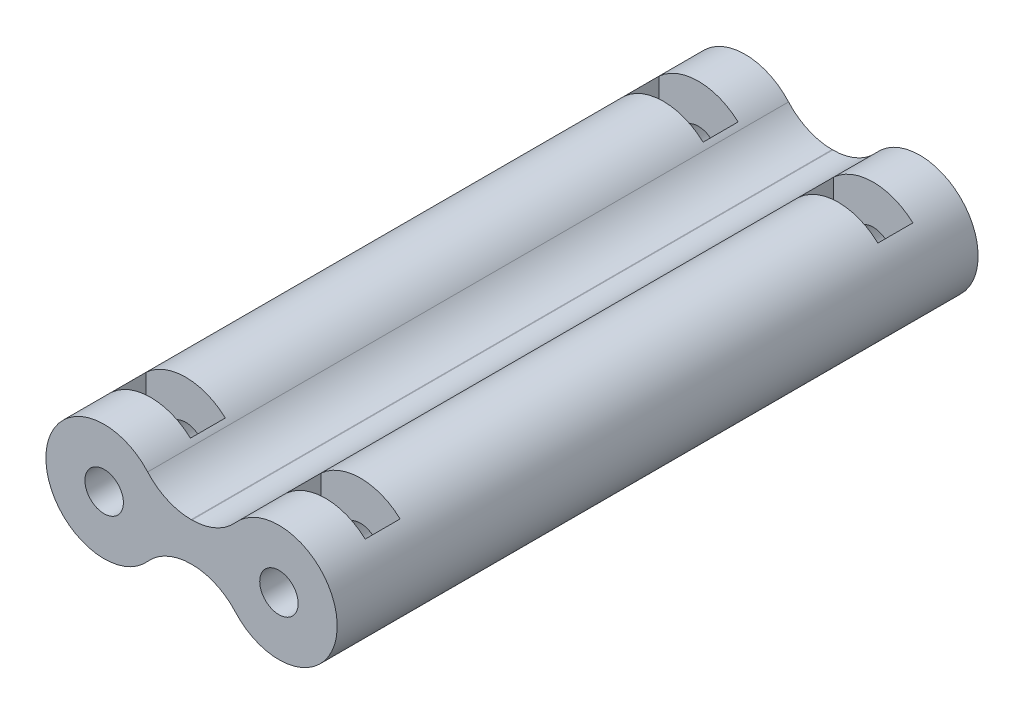
ISO-10303-21;
HEADER;
FILE_DESCRIPTION(('STEP AP214'),'2;1');
FILE_NAME('part.step','',(''),(''),'','','');
FILE_SCHEMA(('AUTOMOTIVE_DESIGN { 1 0 10303 214 1 1 1 1 }'));
ENDSEC;
DATA;
#1=APPLICATION_CONTEXT('core data for automotive mechanical design processes');
#2=APPLICATION_PROTOCOL_DEFINITION('international standard','automotive_design',2000,#1);
#3=PRODUCT_CONTEXT('',#1,'mechanical');
#4=PRODUCT('Part','Part','',(#3));
#5=PRODUCT_RELATED_PRODUCT_CATEGORY('part','',(#4));
#6=PRODUCT_DEFINITION_FORMATION('','',#4);
#7=PRODUCT_DEFINITION_CONTEXT('part definition',#1,'design');
#8=PRODUCT_DEFINITION('design','',#6,#7);
#9=PRODUCT_DEFINITION_SHAPE('','',#8);
#10=(LENGTH_UNIT() NAMED_UNIT(*) SI_UNIT(.MILLI.,.METRE.));
#11=(NAMED_UNIT(*) PLANE_ANGLE_UNIT() SI_UNIT($,.RADIAN.));
#12=(NAMED_UNIT(*) SI_UNIT($,.STERADIAN.) SOLID_ANGLE_UNIT());
#13=UNCERTAINTY_MEASURE_WITH_UNIT(LENGTH_MEASURE(1.E-05),#10,'distance_accuracy_value','');
#14=(GEOMETRIC_REPRESENTATION_CONTEXT(3) GLOBAL_UNCERTAINTY_ASSIGNED_CONTEXT((#13)) GLOBAL_UNIT_ASSIGNED_CONTEXT((#10,
#11,#12)) REPRESENTATION_CONTEXT('',''));
#15=CARTESIAN_POINT('',(0.,0.,0.));
#16=DIRECTION('',(0.,0.,1.));
#17=DIRECTION('',(1.,0.,0.));
#18=AXIS2_PLACEMENT_3D('',#15,#16,#17);
#19=CARTESIAN_POINT('',(-7.5,0.,55.));
#20=DIRECTION('',(0.,0.,-1.));
#21=DIRECTION('',(-1.,0.,0.));
#22=AXIS2_PLACEMENT_3D('',#19,#20,#21);
#23=CYLINDRICAL_SURFACE('',#22,5.);
#24=DIRECTION('',(0.,0.,-1.));
#25=VECTOR('',#24,1.);
#26=CARTESIAN_POINT('',(-10.9,-3.66606055596469,55.));
#27=LINE('',#26,#25);
#28=CARTESIAN_POINT('',(-10.9,-3.66606055596468,51.));
#29=VERTEX_POINT('',#28);
#30=CARTESIAN_POINT('',(-10.9,-3.66606055596468,48.));
#31=VERTEX_POINT('',#30);
#32=EDGE_CURVE('E40',#29,#31,#27,.T.);
#33=ORIENTED_EDGE('',*,*,#32,.F.);
#34=CARTESIAN_POINT('',(-7.5,0.,51.));
#35=DIRECTION('',(0.,0.,1.));
#36=DIRECTION('',(1.,0.,0.));
#37=AXIS2_PLACEMENT_3D('',#34,#35,#36);
#38=CIRCLE('',#37,5.);
#39=CARTESIAN_POINT('',(-4.09999999999999,-3.66606055596466,51.));
#40=VERTEX_POINT('',#39);
#41=EDGE_CURVE('E47',#29,#40,#38,.T.);
#42=ORIENTED_EDGE('',*,*,#41,.T.);
#43=DIRECTION('',(0.,0.,-1.));
#44=VECTOR('',#43,1.);
#45=CARTESIAN_POINT('',(-4.09999999999999,-3.66606055596466,55.));
#46=LINE('',#45,#44);
#47=CARTESIAN_POINT('',(-4.09999999999999,-3.66606055596466,48.));
#48=VERTEX_POINT('',#47);
#49=EDGE_CURVE('E383',#40,#48,#46,.T.);
#50=ORIENTED_EDGE('',*,*,#49,.T.);
#51=CARTESIAN_POINT('',(-7.5,0.,48.));
#52=DIRECTION('',(0.,0.,1.));
#53=DIRECTION('',(1.,0.,0.));
#54=AXIS2_PLACEMENT_3D('',#51,#52,#53);
#55=CIRCLE('',#54,5.);
#56=EDGE_CURVE('E248',#31,#48,#55,.T.);
#57=ORIENTED_EDGE('',*,*,#56,.F.);
#58=EDGE_LOOP('',(#33,#42,#50,#57));
#59=FACE_BOUND('',#58,.T.);
#60=DIRECTION('',(0.,0.,-1.));
#61=VECTOR('',#60,1.);
#62=CARTESIAN_POINT('',(-10.9,-3.66606055596467,55.));
#63=LINE('',#62,#61);
#64=CARTESIAN_POINT('',(-10.9,-3.66606055596467,4.));
#65=VERTEX_POINT('',#64);
#66=CARTESIAN_POINT('',(-10.9,-3.66606055596467,7.));
#67=VERTEX_POINT('',#66);
#68=EDGE_CURVE('E352',#65,#67,#63,.F.);
#69=ORIENTED_EDGE('',*,*,#68,.T.);
#70=CARTESIAN_POINT('',(-7.5,0.,7.));
#71=DIRECTION('',(0.,0.,1.));
#72=DIRECTION('',(1.,0.,0.));
#73=AXIS2_PLACEMENT_3D('',#70,#71,#72);
#74=CIRCLE('',#73,5.);
#75=CARTESIAN_POINT('',(-4.1,-3.66606055596467,7.));
#76=VERTEX_POINT('',#75);
#77=EDGE_CURVE('E268',#67,#76,#74,.T.);
#78=ORIENTED_EDGE('',*,*,#77,.T.);
#79=DIRECTION('',(0.,0.,-1.));
#80=VECTOR('',#79,1.);
#81=CARTESIAN_POINT('',(-4.09999999999998,-3.66606055596466,55.));
#82=LINE('',#81,#80);
#83=CARTESIAN_POINT('',(-4.1,-3.66606055596467,4.));
#84=VERTEX_POINT('',#83);
#85=EDGE_CURVE('E349',#84,#76,#82,.F.);
#86=ORIENTED_EDGE('',*,*,#85,.F.);
#87=CARTESIAN_POINT('',(-7.5,0.,4.));
#88=DIRECTION('',(0.,0.,1.));
#89=DIRECTION('',(1.,0.,0.));
#90=AXIS2_PLACEMENT_3D('',#87,#88,#89);
#91=CIRCLE('',#90,5.);
#92=EDGE_CURVE('E264',#65,#84,#91,.T.);
#93=ORIENTED_EDGE('',*,*,#92,.F.);
#94=EDGE_LOOP('',(#69,#78,#86,#93));
#95=FACE_BOUND('',#94,.T.);
#96=CARTESIAN_POINT('',(-7.5,0.,0.));
#97=DIRECTION('',(0.,0.,1.));
#98=DIRECTION('',(1.,0.,0.));
#99=AXIS2_PLACEMENT_3D('',#96,#97,#98);
#100=CIRCLE('',#99,5.);
#101=CARTESIAN_POINT('',(-3.76578321464862,3.325,0.));
#102=VERTEX_POINT('',#101);
#103=CARTESIAN_POINT('',(-3.76578321464862,-3.325,0.));
#104=VERTEX_POINT('',#103);
#105=EDGE_CURVE('E278',#102,#104,#100,.T.);
#106=ORIENTED_EDGE('',*,*,#105,.T.);
#107=DIRECTION('',(0.,0.,-1.));
#108=VECTOR('',#107,1.);
#109=CARTESIAN_POINT('',(-3.76578321464862,-3.325,55.));
#110=LINE('',#109,#108);
#111=CARTESIAN_POINT('',(-3.76578321464862,-3.325,55.));
#112=VERTEX_POINT('',#111);
#113=EDGE_CURVE('E312',#104,#112,#110,.F.);
#114=ORIENTED_EDGE('',*,*,#113,.T.);
#115=CARTESIAN_POINT('',(-7.5,0.,55.));
#116=DIRECTION('',(0.,0.,1.));
#117=DIRECTION('',(1.,0.,0.));
#118=AXIS2_PLACEMENT_3D('',#115,#116,#117);
#119=CIRCLE('',#118,5.);
#120=CARTESIAN_POINT('',(-3.76578321464862,3.325,55.));
#121=VERTEX_POINT('',#120);
#122=EDGE_CURVE('E281',#121,#112,#119,.T.);
#123=ORIENTED_EDGE('',*,*,#122,.F.);
#124=DIRECTION('',(0.,0.,-1.));
#125=VECTOR('',#124,1.);
#126=CARTESIAN_POINT('',(-3.76578321464862,3.325,55.));
#127=LINE('',#126,#125);
#128=EDGE_CURVE('E309',#121,#102,#127,.T.);
#129=ORIENTED_EDGE('',*,*,#128,.T.);
#130=EDGE_LOOP('',(#106,#114,#123,#129));
#131=FACE_BOUND('',#130,.T.);
#132=CARTESIAN_POINT('',(-4.1,3.66606055596467,4.));
#133=VERTEX_POINT('',#132);
#134=CARTESIAN_POINT('',(-10.9,3.66606055596467,4.));
#135=VERTEX_POINT('',#134);
#136=EDGE_CURVE('E261',#133,#135,#91,.T.);
#137=ORIENTED_EDGE('',*,*,#136,.F.);
#138=DIRECTION('',(0.,0.,-1.));
#139=VECTOR('',#138,1.);
#140=CARTESIAN_POINT('',(-4.09999999999998,3.66606055596466,55.));
#141=LINE('',#140,#139);
#142=CARTESIAN_POINT('',(-4.1,3.66606055596467,7.));
#143=VERTEX_POINT('',#142);
#144=EDGE_CURVE('E347',#143,#133,#141,.T.);
#145=ORIENTED_EDGE('',*,*,#144,.F.);
#146=CARTESIAN_POINT('',(-10.9,3.66606055596467,7.));
#147=VERTEX_POINT('',#146);
#148=EDGE_CURVE('E265',#143,#147,#74,.T.);
#149=ORIENTED_EDGE('',*,*,#148,.T.);
#150=DIRECTION('',(0.,0.,-1.));
#151=VECTOR('',#150,1.);
#152=CARTESIAN_POINT('',(-10.9,3.66606055596467,55.));
#153=LINE('',#152,#151);
#154=EDGE_CURVE('E340',#147,#135,#153,.T.);
#155=ORIENTED_EDGE('',*,*,#154,.T.);
#156=EDGE_LOOP('',(#137,#145,#149,#155));
#157=FACE_BOUND('',#156,.T.);
#158=CARTESIAN_POINT('',(-4.09999999999999,3.66606055596466,48.));
#159=VERTEX_POINT('',#158);
#160=CARTESIAN_POINT('',(-10.9,3.66606055596468,48.));
#161=VERTEX_POINT('',#160);
#162=EDGE_CURVE('E245',#159,#161,#55,.T.);
#163=ORIENTED_EDGE('',*,*,#162,.F.);
#164=DIRECTION('',(0.,0.,-1.));
#165=VECTOR('',#164,1.);
#166=CARTESIAN_POINT('',(-4.09999999999999,3.66606055596466,55.));
#167=LINE('',#166,#165);
#168=CARTESIAN_POINT('',(-4.09999999999999,3.66606055596466,51.));
#169=VERTEX_POINT('',#168);
#170=EDGE_CURVE('E11',#159,#169,#167,.F.);
#171=ORIENTED_EDGE('',*,*,#170,.T.);
#172=CARTESIAN_POINT('',(-10.9,3.66606055596468,51.));
#173=VERTEX_POINT('',#172);
#174=EDGE_CURVE('E54',#169,#173,#38,.T.);
#175=ORIENTED_EDGE('',*,*,#174,.T.);
#176=DIRECTION('',(0.,0.,-1.));
#177=VECTOR('',#176,1.);
#178=CARTESIAN_POINT('',(-10.9,3.66606055596469,55.));
#179=LINE('',#178,#177);
#180=EDGE_CURVE('E380',#161,#173,#179,.F.);
#181=ORIENTED_EDGE('',*,*,#180,.F.);
#182=EDGE_LOOP('',(#163,#171,#175,#181));
#183=FACE_BOUND('',#182,.T.);
#184=ADVANCED_FACE('F32',(#59,#95,#131,#157,#183),#23,.T.);
#185=CARTESIAN_POINT('',(7.5,0.,55.));
#186=DIRECTION('',(0.,0.,-1.));
#187=DIRECTION('',(-1.,0.,0.));
#188=AXIS2_PLACEMENT_3D('',#185,#186,#187);
#189=CYLINDRICAL_SURFACE('',#188,5.);
#190=DIRECTION('',(0.,0.,-1.));
#191=VECTOR('',#190,1.);
#192=CARTESIAN_POINT('',(10.9,-3.66606055596467,55.));
#193=LINE('',#192,#191);
#194=CARTESIAN_POINT('',(10.9,-3.66606055596467,4.));
#195=VERTEX_POINT('',#194);
#196=CARTESIAN_POINT('',(10.9,-3.66606055596467,7.));
#197=VERTEX_POINT('',#196);
#198=EDGE_CURVE('E375',#195,#197,#193,.F.);
#199=ORIENTED_EDGE('',*,*,#198,.F.);
#200=CARTESIAN_POINT('',(7.5,0.,4.));
#201=DIRECTION('',(0.,0.,-1.));
#202=DIRECTION('',(-1.,0.,0.));
#203=AXIS2_PLACEMENT_3D('',#200,#201,#202);
#204=CIRCLE('',#203,5.);
#205=CARTESIAN_POINT('',(4.1,-3.66606055596467,4.));
#206=VERTEX_POINT('',#205);
#207=EDGE_CURVE('E238',#195,#206,#204,.T.);
#208=ORIENTED_EDGE('',*,*,#207,.T.);
#209=DIRECTION('',(0.,0.,-1.));
#210=VECTOR('',#209,1.);
#211=CARTESIAN_POINT('',(4.09999999999999,-3.66606055596466,55.));
#212=LINE('',#211,#210);
#213=CARTESIAN_POINT('',(4.1,-3.66606055596466,7.));
#214=VERTEX_POINT('',#213);
#215=EDGE_CURVE('E372',#206,#214,#212,.F.);
#216=ORIENTED_EDGE('',*,*,#215,.T.);
#217=CARTESIAN_POINT('',(7.5,0.,7.));
#218=DIRECTION('',(0.,0.,-1.));
#219=DIRECTION('',(-1.,0.,0.));
#220=AXIS2_PLACEMENT_3D('',#217,#218,#219);
#221=CIRCLE('',#220,5.);
#222=EDGE_CURVE('E242',#197,#214,#221,.T.);
#223=ORIENTED_EDGE('',*,*,#222,.F.);
#224=EDGE_LOOP('',(#199,#208,#216,#223));
#225=FACE_BOUND('',#224,.T.);
#226=DIRECTION('',(0.,0.,-1.));
#227=VECTOR('',#226,1.);
#228=CARTESIAN_POINT('',(10.9,-3.66606055596467,55.));
#229=LINE('',#228,#227);
#230=CARTESIAN_POINT('',(10.9,-3.66606055596467,51.));
#231=VERTEX_POINT('',#230);
#232=CARTESIAN_POINT('',(10.9,-3.66606055596467,48.));
#233=VERTEX_POINT('',#232);
#234=EDGE_CURVE('E195',#231,#233,#229,.T.);
#235=ORIENTED_EDGE('',*,*,#234,.T.);
#236=CARTESIAN_POINT('',(7.5,0.,48.));
#237=DIRECTION('',(0.,0.,-1.));
#238=DIRECTION('',(-1.,0.,0.));
#239=AXIS2_PLACEMENT_3D('',#236,#237,#238);
#240=CIRCLE('',#239,5.);
#241=CARTESIAN_POINT('',(4.1,-3.66606055596467,48.));
#242=VERTEX_POINT('',#241);
#243=EDGE_CURVE('E234',#233,#242,#240,.T.);
#244=ORIENTED_EDGE('',*,*,#243,.T.);
#245=DIRECTION('',(0.,0.,-1.));
#246=VECTOR('',#245,1.);
#247=CARTESIAN_POINT('',(4.1,-3.66606055596468,55.));
#248=LINE('',#247,#246);
#249=CARTESIAN_POINT('',(4.1,-3.66606055596467,51.));
#250=VERTEX_POINT('',#249);
#251=EDGE_CURVE('E206',#250,#242,#248,.T.);
#252=ORIENTED_EDGE('',*,*,#251,.F.);
#253=CARTESIAN_POINT('',(7.5,0.,51.));
#254=DIRECTION('',(0.,0.,-1.));
#255=DIRECTION('',(-1.,0.,0.));
#256=AXIS2_PLACEMENT_3D('',#253,#254,#255);
#257=CIRCLE('',#256,5.);
#258=EDGE_CURVE('E211',#231,#250,#257,.T.);
#259=ORIENTED_EDGE('',*,*,#258,.F.);
#260=EDGE_LOOP('',(#235,#244,#252,#259));
#261=FACE_BOUND('',#260,.T.);
#262=CARTESIAN_POINT('',(7.5,0.,55.));
#263=DIRECTION('',(0.,0.,1.));
#264=DIRECTION('',(1.,0.,0.));
#265=AXIS2_PLACEMENT_3D('',#262,#263,#264);
#266=CIRCLE('',#265,5.);
#267=CARTESIAN_POINT('',(3.76578321464862,-3.325,55.));
#268=VERTEX_POINT('',#267);
#269=CARTESIAN_POINT('',(3.76578321464862,3.325,55.));
#270=VERTEX_POINT('',#269);
#271=EDGE_CURVE('E288',#268,#270,#266,.T.);
#272=ORIENTED_EDGE('',*,*,#271,.F.);
#273=DIRECTION('',(0.,0.,-1.));
#274=VECTOR('',#273,1.);
#275=CARTESIAN_POINT('',(3.76578321464862,-3.325,55.));
#276=LINE('',#275,#274);
#277=CARTESIAN_POINT('',(3.76578321464862,-3.325,0.));
#278=VERTEX_POINT('',#277);
#279=EDGE_CURVE('E316',#268,#278,#276,.T.);
#280=ORIENTED_EDGE('',*,*,#279,.T.);
#281=CARTESIAN_POINT('',(7.5,0.,0.));
#282=DIRECTION('',(0.,0.,1.));
#283=DIRECTION('',(1.,0.,0.));
#284=AXIS2_PLACEMENT_3D('',#281,#282,#283);
#285=CIRCLE('',#284,5.);
#286=CARTESIAN_POINT('',(3.76578321464862,3.325,0.));
#287=VERTEX_POINT('',#286);
#288=EDGE_CURVE('E300',#278,#287,#285,.T.);
#289=ORIENTED_EDGE('',*,*,#288,.T.);
#290=DIRECTION('',(0.,0.,-1.));
#291=VECTOR('',#290,1.);
#292=CARTESIAN_POINT('',(3.76578321464862,3.325,55.));
#293=LINE('',#292,#291);
#294=EDGE_CURVE('E314',#287,#270,#293,.F.);
#295=ORIENTED_EDGE('',*,*,#294,.T.);
#296=EDGE_LOOP('',(#272,#280,#289,#295));
#297=FACE_BOUND('',#296,.T.);
#298=CARTESIAN_POINT('',(4.1,3.66606055596467,51.));
#299=VERTEX_POINT('',#298);
#300=CARTESIAN_POINT('',(10.9,3.66606055596467,51.));
#301=VERTEX_POINT('',#300);
#302=EDGE_CURVE('E214',#299,#301,#257,.T.);
#303=ORIENTED_EDGE('',*,*,#302,.F.);
#304=DIRECTION('',(0.,0.,-1.));
#305=VECTOR('',#304,1.);
#306=CARTESIAN_POINT('',(4.1,3.66606055596468,55.));
#307=LINE('',#306,#305);
#308=CARTESIAN_POINT('',(4.1,3.66606055596467,48.));
#309=VERTEX_POINT('',#308);
#310=EDGE_CURVE('E367',#309,#299,#307,.F.);
#311=ORIENTED_EDGE('',*,*,#310,.F.);
#312=CARTESIAN_POINT('',(10.9,3.66606055596467,48.));
#313=VERTEX_POINT('',#312);
#314=EDGE_CURVE('E231',#309,#313,#240,.T.);
#315=ORIENTED_EDGE('',*,*,#314,.T.);
#316=DIRECTION('',(0.,0.,-1.));
#317=VECTOR('',#316,1.);
#318=CARTESIAN_POINT('',(10.9,3.66606055596467,55.));
#319=LINE('',#318,#317);
#320=EDGE_CURVE('E354',#313,#301,#319,.F.);
#321=ORIENTED_EDGE('',*,*,#320,.T.);
#322=EDGE_LOOP('',(#303,#311,#315,#321));
#323=FACE_BOUND('',#322,.T.);
#324=CARTESIAN_POINT('',(4.1,3.66606055596466,7.));
#325=VERTEX_POINT('',#324);
#326=CARTESIAN_POINT('',(10.9,3.66606055596467,7.));
#327=VERTEX_POINT('',#326);
#328=EDGE_CURVE('E239',#325,#327,#221,.T.);
#329=ORIENTED_EDGE('',*,*,#328,.F.);
#330=DIRECTION('',(0.,0.,-1.));
#331=VECTOR('',#330,1.);
#332=CARTESIAN_POINT('',(4.09999999999999,3.66606055596466,55.));
#333=LINE('',#332,#331);
#334=CARTESIAN_POINT('',(4.1,3.66606055596467,4.));
#335=VERTEX_POINT('',#334);
#336=EDGE_CURVE('E377',#325,#335,#333,.T.);
#337=ORIENTED_EDGE('',*,*,#336,.T.);
#338=CARTESIAN_POINT('',(10.9,3.66606055596467,4.));
#339=VERTEX_POINT('',#338);
#340=EDGE_CURVE('E235',#335,#339,#204,.T.);
#341=ORIENTED_EDGE('',*,*,#340,.T.);
#342=DIRECTION('',(0.,0.,-1.));
#343=VECTOR('',#342,1.);
#344=CARTESIAN_POINT('',(10.9,3.66606055596467,55.));
#345=LINE('',#344,#343);
#346=EDGE_CURVE('E205',#327,#339,#345,.T.);
#347=ORIENTED_EDGE('',*,*,#346,.F.);
#348=EDGE_LOOP('',(#329,#337,#341,#347));
#349=FACE_BOUND('',#348,.T.);
#350=ADVANCED_FACE('F218',(#225,#261,#297,#323,#349),#189,.T.);
#351=CARTESIAN_POINT('',(-7.5,0.,55.));
#352=DIRECTION('',(0.,0.,-1.));
#353=DIRECTION('',(-1.,0.,0.));
#354=AXIS2_PLACEMENT_3D('',#351,#352,#353);
#355=CYLINDRICAL_SURFACE('',#354,1.65);
#356=CARTESIAN_POINT('',(-7.5,0.,7.));
#357=DIRECTION('',(0.,0.,1.));
#358=DIRECTION('',(1.,0.,0.));
#359=AXIS2_PLACEMENT_3D('',#356,#357,#358);
#360=CIRCLE('',#359,1.65);
#361=CARTESIAN_POINT('',(-5.85,0.,7.));
#362=VERTEX_POINT('',#361);
#363=EDGE_CURVE('E263',#362,#362,#360,.T.);
#364=ORIENTED_EDGE('',*,*,#363,.F.);
#365=EDGE_LOOP('',(#364));
#366=FACE_BOUND('',#365,.T.);
#367=CARTESIAN_POINT('',(-7.5,0.,48.));
#368=DIRECTION('',(0.,0.,1.));
#369=DIRECTION('',(1.,0.,0.));
#370=AXIS2_PLACEMENT_3D('',#367,#368,#369);
#371=CIRCLE('',#370,1.65);
#372=CARTESIAN_POINT('',(-5.85,0.,48.));
#373=VERTEX_POINT('',#372);
#374=EDGE_CURVE('E244',#373,#373,#371,.T.);
#375=ORIENTED_EDGE('',*,*,#374,.T.);
#376=EDGE_LOOP('',(#375));
#377=FACE_BOUND('',#376,.T.);
#378=ADVANCED_FACE('F456',(#366,#377),#355,.F.);
#379=CARTESIAN_POINT('',(7.5,0.,55.));
#380=DIRECTION('',(0.,0.,-1.));
#381=DIRECTION('',(-1.,0.,0.));
#382=AXIS2_PLACEMENT_3D('',#379,#380,#381);
#383=CYLINDRICAL_SURFACE('',#382,1.65);
#384=CARTESIAN_POINT('',(7.5,0.,55.));
#385=DIRECTION('',(0.,0.,1.));
#386=DIRECTION('',(1.,0.,0.));
#387=AXIS2_PLACEMENT_3D('',#384,#385,#386);
#388=CIRCLE('',#387,1.65);
#389=CARTESIAN_POINT('',(9.15,0.,55.));
#390=VERTEX_POINT('',#389);
#391=EDGE_CURVE('E269',#390,#390,#388,.T.);
#392=ORIENTED_EDGE('',*,*,#391,.T.);
#393=EDGE_LOOP('',(#392));
#394=FACE_BOUND('',#393,.T.);
#395=CARTESIAN_POINT('',(7.5,0.,51.));
#396=DIRECTION('',(0.,0.,-1.));
#397=DIRECTION('',(-1.,0.,0.));
#398=AXIS2_PLACEMENT_3D('',#395,#396,#397);
#399=CIRCLE('',#398,1.65);
#400=CARTESIAN_POINT('',(5.85,0.,51.));
#401=VERTEX_POINT('',#400);
#402=EDGE_CURVE('E221',#401,#401,#399,.T.);
#403=ORIENTED_EDGE('',*,*,#402,.T.);
#404=EDGE_LOOP('',(#403));
#405=FACE_BOUND('',#404,.T.);
#406=ADVANCED_FACE('F519',(#394,#405),#383,.F.);
#407=CARTESIAN_POINT('',(-7.5,0.,0.));
#408=DIRECTION('',(0.,0.,1.));
#409=DIRECTION('',(1.,0.,0.));
#410=AXIS2_PLACEMENT_3D('',#407,#408,#409);
#411=CIRCLE('',#410,1.65);
#412=CARTESIAN_POINT('',(-5.85,0.,0.));
#413=VERTEX_POINT('',#412);
#414=EDGE_CURVE('E272',#413,#413,#411,.T.);
#415=ORIENTED_EDGE('',*,*,#414,.F.);
#416=EDGE_LOOP('',(#415));
#417=FACE_BOUND('',#416,.T.);
#418=CARTESIAN_POINT('',(-7.5,0.,4.));
#419=DIRECTION('',(0.,0.,1.));
#420=DIRECTION('',(1.,0.,0.));
#421=AXIS2_PLACEMENT_3D('',#418,#419,#420);
#422=CIRCLE('',#421,1.65);
#423=CARTESIAN_POINT('',(-5.85,0.,4.));
#424=VERTEX_POINT('',#423);
#425=EDGE_CURVE('E252',#424,#424,#422,.T.);
#426=ORIENTED_EDGE('',*,*,#425,.T.);
#427=EDGE_LOOP('',(#426));
#428=FACE_BOUND('',#427,.T.);
#429=ADVANCED_FACE('F525',(#417,#428),#355,.F.);
#430=CARTESIAN_POINT('',(-7.5,0.,55.));
#431=DIRECTION('',(0.,0.,1.));
#432=DIRECTION('',(1.,0.,0.));
#433=AXIS2_PLACEMENT_3D('',#430,#431,#432);
#434=PLANE('',#433);
#435=CARTESIAN_POINT('',(-7.5,0.,55.));
#436=DIRECTION('',(0.,0.,1.));
#437=DIRECTION('',(1.,0.,0.));
#438=AXIS2_PLACEMENT_3D('',#435,#436,#437);
#439=CIRCLE('',#438,1.65);
#440=CARTESIAN_POINT('',(-5.85,0.,55.));
#441=VERTEX_POINT('',#440);
#442=EDGE_CURVE('E275',#441,#441,#439,.T.);
#443=ORIENTED_EDGE('',*,*,#442,.F.);
#444=EDGE_LOOP('',(#443));
#445=FACE_BOUND('',#444,.T.);
#446=DIRECTION('',(-1.,0.,0.));
#447=VECTOR('',#446,1.);
#448=CARTESIAN_POINT('',(-2.78009533994594,1.65,55.));
#449=LINE('',#448,#447);
#450=CARTESIAN_POINT('',(0.0315664292972377,1.65,55.));
#451=VERTEX_POINT('',#450);
#452=CARTESIAN_POINT('',(-0.0315664292972377,1.65,55.));
#453=VERTEX_POINT('',#452);
#454=EDGE_CURVE('E291',#451,#453,#449,.T.);
#455=ORIENTED_EDGE('',*,*,#454,.T.);
#456=CARTESIAN_POINT('',(-0.0315664292972377,6.65,55.));
#457=DIRECTION('',(0.,0.,1.));
#458=DIRECTION('',(1.,0.,0.));
#459=AXIS2_PLACEMENT_3D('',#456,#457,#458);
#460=CIRCLE('',#459,5.);
#461=EDGE_CURVE('E338',#453,#121,#460,.F.);
#462=ORIENTED_EDGE('',*,*,#461,.T.);
#463=ORIENTED_EDGE('',*,*,#122,.T.);
#464=CARTESIAN_POINT('',(-0.0315664292972377,-6.65,55.));
#465=DIRECTION('',(0.,0.,1.));
#466=DIRECTION('',(1.,0.,0.));
#467=AXIS2_PLACEMENT_3D('',#464,#465,#466);
#468=CIRCLE('',#467,5.);
#469=CARTESIAN_POINT('',(-0.0315664292972377,-1.65,55.));
#470=VERTEX_POINT('',#469);
#471=EDGE_CURVE('E326',#112,#470,#468,.F.);
#472=ORIENTED_EDGE('',*,*,#471,.T.);
#473=DIRECTION('',(1.,0.,0.));
#474=VECTOR('',#473,1.);
#475=CARTESIAN_POINT('',(-2.78009533994594,-1.65,55.));
#476=LINE('',#475,#474);
#477=CARTESIAN_POINT('',(0.0315664292972377,-1.65,55.));
#478=VERTEX_POINT('',#477);
#479=EDGE_CURVE('E284',#470,#478,#476,.T.);
#480=ORIENTED_EDGE('',*,*,#479,.T.);
#481=CARTESIAN_POINT('',(0.0315664292972377,-6.65,55.));
#482=DIRECTION('',(0.,0.,1.));
#483=DIRECTION('',(1.,0.,0.));
#484=AXIS2_PLACEMENT_3D('',#481,#482,#483);
#485=CIRCLE('',#484,5.);
#486=EDGE_CURVE('E330',#478,#268,#485,.F.);
#487=ORIENTED_EDGE('',*,*,#486,.T.);
#488=ORIENTED_EDGE('',*,*,#271,.T.);
#489=CARTESIAN_POINT('',(0.0315664292972377,6.65,55.));
#490=DIRECTION('',(0.,0.,1.));
#491=DIRECTION('',(1.,0.,0.));
#492=AXIS2_PLACEMENT_3D('',#489,#490,#491);
#493=CIRCLE('',#492,5.);
#494=EDGE_CURVE('E334',#270,#451,#493,.F.);
#495=ORIENTED_EDGE('',*,*,#494,.T.);
#496=EDGE_LOOP('',(#455,#462,#463,#472,#480,#487,#488,#495));
#497=FACE_BOUND('',#496,.T.);
#498=ORIENTED_EDGE('',*,*,#391,.F.);
#499=EDGE_LOOP('',(#498));
#500=FACE_BOUND('',#499,.T.);
#501=ADVANCED_FACE('F482',(#445,#497,#500),#434,.T.);
#502=CARTESIAN_POINT('',(-7.5,0.,0.));
#503=DIRECTION('',(0.,0.,1.));
#504=DIRECTION('',(1.,0.,0.));
#505=AXIS2_PLACEMENT_3D('',#502,#503,#504);
#506=PLANE('',#505);
#507=ORIENTED_EDGE('',*,*,#105,.F.);
#508=CARTESIAN_POINT('',(-0.0315664292972377,6.65,0.));
#509=DIRECTION('',(0.,0.,1.));
#510=DIRECTION('',(1.,0.,0.));
#511=AXIS2_PLACEMENT_3D('',#508,#509,#510);
#512=CIRCLE('',#511,5.);
#513=CARTESIAN_POINT('',(-0.0315664292972377,1.65,0.));
#514=VERTEX_POINT('',#513);
#515=EDGE_CURVE('E336',#102,#514,#512,.T.);
#516=ORIENTED_EDGE('',*,*,#515,.T.);
#517=DIRECTION('',(-1.,0.,0.));
#518=VECTOR('',#517,1.);
#519=CARTESIAN_POINT('',(-2.78009533994594,1.65,0.));
#520=LINE('',#519,#518);
#521=CARTESIAN_POINT('',(0.0315664292972377,1.65,0.));
#522=VERTEX_POINT('',#521);
#523=EDGE_CURVE('E285',#522,#514,#520,.T.);
#524=ORIENTED_EDGE('',*,*,#523,.F.);
#525=CARTESIAN_POINT('',(0.0315664292972377,6.65,0.));
#526=DIRECTION('',(0.,0.,1.));
#527=DIRECTION('',(1.,0.,0.));
#528=AXIS2_PLACEMENT_3D('',#525,#526,#527);
#529=CIRCLE('',#528,5.);
#530=EDGE_CURVE('E332',#522,#287,#529,.T.);
#531=ORIENTED_EDGE('',*,*,#530,.T.);
#532=ORIENTED_EDGE('',*,*,#288,.F.);
#533=CARTESIAN_POINT('',(0.0315664292972377,-6.65,0.));
#534=DIRECTION('',(0.,0.,1.));
#535=DIRECTION('',(1.,0.,0.));
#536=AXIS2_PLACEMENT_3D('',#533,#534,#535);
#537=CIRCLE('',#536,5.);
#538=CARTESIAN_POINT('',(0.0315664292972377,-1.65,0.));
#539=VERTEX_POINT('',#538);
#540=EDGE_CURVE('E328',#278,#539,#537,.T.);
#541=ORIENTED_EDGE('',*,*,#540,.T.);
#542=DIRECTION('',(1.,0.,0.));
#543=VECTOR('',#542,1.);
#544=CARTESIAN_POINT('',(-2.78009533994594,-1.65,0.));
#545=LINE('',#544,#543);
#546=CARTESIAN_POINT('',(-0.0315664292972377,-1.65,0.));
#547=VERTEX_POINT('',#546);
#548=EDGE_CURVE('E297',#547,#539,#545,.T.);
#549=ORIENTED_EDGE('',*,*,#548,.F.);
#550=CARTESIAN_POINT('',(-0.0315664292972377,-6.65,0.));
#551=DIRECTION('',(0.,0.,1.));
#552=DIRECTION('',(1.,0.,0.));
#553=AXIS2_PLACEMENT_3D('',#550,#551,#552);
#554=CIRCLE('',#553,5.);
#555=EDGE_CURVE('E324',#547,#104,#554,.T.);
#556=ORIENTED_EDGE('',*,*,#555,.T.);
#557=EDGE_LOOP('',(#507,#516,#524,#531,#532,#541,#549,#556));
#558=FACE_BOUND('',#557,.T.);
#559=ORIENTED_EDGE('',*,*,#414,.T.);
#560=EDGE_LOOP('',(#559));
#561=FACE_BOUND('',#560,.T.);
#562=CARTESIAN_POINT('',(7.5,0.,0.));
#563=DIRECTION('',(0.,0.,1.));
#564=DIRECTION('',(1.,0.,0.));
#565=AXIS2_PLACEMENT_3D('',#562,#563,#564);
#566=CIRCLE('',#565,1.65);
#567=CARTESIAN_POINT('',(9.15,0.,0.));
#568=VERTEX_POINT('',#567);
#569=EDGE_CURVE('E267',#568,#568,#566,.T.);
#570=ORIENTED_EDGE('',*,*,#569,.T.);
#571=EDGE_LOOP('',(#570));
#572=FACE_BOUND('',#571,.T.);
#573=ADVANCED_FACE('F507',(#558,#561,#572),#506,.F.);
#574=CARTESIAN_POINT('',(-2.78009533994594,-1.65,55.));
#575=DIRECTION('',(0.,1.,0.));
#576=DIRECTION('',(0.,0.,1.));
#577=AXIS2_PLACEMENT_3D('',#574,#575,#576);
#578=PLANE('',#577);
#579=ORIENTED_EDGE('',*,*,#479,.F.);
#580=DIRECTION('',(0.,0.,1.));
#581=VECTOR('',#580,1.);
#582=CARTESIAN_POINT('',(-0.0315664292972377,-1.65,0.));
#583=LINE('',#582,#581);
#584=EDGE_CURVE('E306',#470,#547,#583,.F.);
#585=ORIENTED_EDGE('',*,*,#584,.T.);
#586=ORIENTED_EDGE('',*,*,#548,.T.);
#587=DIRECTION('',(0.,0.,1.));
#588=VECTOR('',#587,1.);
#589=CARTESIAN_POINT('',(0.0315664292972377,-1.65,55.));
#590=LINE('',#589,#588);
#591=EDGE_CURVE('E294',#539,#478,#590,.T.);
#592=ORIENTED_EDGE('',*,*,#591,.T.);
#593=EDGE_LOOP('',(#579,#585,#586,#592));
#594=FACE_BOUND('',#593,.T.);
#595=ADVANCED_FACE('F460',(#594),#578,.F.);
#596=CARTESIAN_POINT('',(-2.78009533994594,1.65,55.));
#597=DIRECTION('',(0.,-1.,0.));
#598=DIRECTION('',(0.,0.,-1.));
#599=AXIS2_PLACEMENT_3D('',#596,#597,#598);
#600=PLANE('',#599);
#601=ORIENTED_EDGE('',*,*,#454,.F.);
#602=DIRECTION('',(0.,0.,1.));
#603=VECTOR('',#602,1.);
#604=CARTESIAN_POINT('',(0.0315664292972377,1.65,0.));
#605=LINE('',#604,#603);
#606=EDGE_CURVE('E321',#451,#522,#605,.F.);
#607=ORIENTED_EDGE('',*,*,#606,.T.);
#608=ORIENTED_EDGE('',*,*,#523,.T.);
#609=DIRECTION('',(0.,0.,1.));
#610=VECTOR('',#609,1.);
#611=CARTESIAN_POINT('',(-0.0315664292972377,1.65,55.));
#612=LINE('',#611,#610);
#613=EDGE_CURVE('E319',#514,#453,#612,.T.);
#614=ORIENTED_EDGE('',*,*,#613,.T.);
#615=EDGE_LOOP('',(#601,#607,#608,#614));
#616=FACE_BOUND('',#615,.T.);
#617=ADVANCED_FACE('F487',(#616),#600,.F.);
#618=CARTESIAN_POINT('',(-7.5,0.,51.));
#619=DIRECTION('',(0.,0.,1.));
#620=DIRECTION('',(1.,0.,0.));
#621=AXIS2_PLACEMENT_3D('',#618,#619,#620);
#622=CIRCLE('',#621,1.65);
#623=CARTESIAN_POINT('',(-5.85,0.,51.));
#624=VERTEX_POINT('',#623);
#625=EDGE_CURVE('E241',#624,#624,#622,.T.);
#626=ORIENTED_EDGE('',*,*,#625,.F.);
#627=EDGE_LOOP('',(#626));
#628=FACE_BOUND('',#627,.T.);
#629=ORIENTED_EDGE('',*,*,#442,.T.);
#630=EDGE_LOOP('',(#629));
#631=FACE_BOUND('',#630,.T.);
#632=ADVANCED_FACE('F516',(#628,#631),#355,.F.);
#633=CARTESIAN_POINT('',(7.5,0.,4.));
#634=DIRECTION('',(0.,0.,-1.));
#635=DIRECTION('',(-1.,0.,0.));
#636=AXIS2_PLACEMENT_3D('',#633,#634,#635);
#637=CIRCLE('',#636,1.65);
#638=CARTESIAN_POINT('',(5.85,0.,4.));
#639=VERTEX_POINT('',#638);
#640=EDGE_CURVE('E233',#639,#639,#637,.T.);
#641=ORIENTED_EDGE('',*,*,#640,.F.);
#642=EDGE_LOOP('',(#641));
#643=FACE_BOUND('',#642,.T.);
#644=ORIENTED_EDGE('',*,*,#569,.F.);
#645=EDGE_LOOP('',(#644));
#646=FACE_BOUND('',#645,.T.);
#647=ADVANCED_FACE('F465',(#643,#646),#383,.F.);
#648=CARTESIAN_POINT('',(-0.0315664292972377,-6.65,55.));
#649=DIRECTION('',(0.,0.,-1.));
#650=DIRECTION('',(-1.,0.,0.));
#651=AXIS2_PLACEMENT_3D('',#648,#649,#650);
#652=CYLINDRICAL_SURFACE('',#651,5.);
#653=ORIENTED_EDGE('',*,*,#471,.F.);
#654=ORIENTED_EDGE('',*,*,#113,.F.);
#655=ORIENTED_EDGE('',*,*,#555,.F.);
#656=ORIENTED_EDGE('',*,*,#584,.F.);
#657=EDGE_LOOP('',(#653,#654,#655,#656));
#658=FACE_BOUND('',#657,.T.);
#659=ADVANCED_FACE('F461',(#658),#652,.F.);
#660=CARTESIAN_POINT('',(0.0315664292972377,-6.65,55.));
#661=DIRECTION('',(0.,0.,-1.));
#662=DIRECTION('',(-1.,0.,0.));
#663=AXIS2_PLACEMENT_3D('',#660,#661,#662);
#664=CYLINDRICAL_SURFACE('',#663,5.);
#665=ORIENTED_EDGE('',*,*,#486,.F.);
#666=ORIENTED_EDGE('',*,*,#591,.F.);
#667=ORIENTED_EDGE('',*,*,#540,.F.);
#668=ORIENTED_EDGE('',*,*,#279,.F.);
#669=EDGE_LOOP('',(#665,#666,#667,#668));
#670=FACE_BOUND('',#669,.T.);
#671=ADVANCED_FACE('F464',(#670),#664,.F.);
#672=CARTESIAN_POINT('',(0.0315664292972377,6.65,55.));
#673=DIRECTION('',(0.,0.,-1.));
#674=DIRECTION('',(-1.,0.,0.));
#675=AXIS2_PLACEMENT_3D('',#672,#673,#674);
#676=CYLINDRICAL_SURFACE('',#675,5.);
#677=ORIENTED_EDGE('',*,*,#494,.F.);
#678=ORIENTED_EDGE('',*,*,#294,.F.);
#679=ORIENTED_EDGE('',*,*,#530,.F.);
#680=ORIENTED_EDGE('',*,*,#606,.F.);
#681=EDGE_LOOP('',(#677,#678,#679,#680));
#682=FACE_BOUND('',#681,.T.);
#683=ADVANCED_FACE('F468',(#682),#676,.F.);
#684=CARTESIAN_POINT('',(-0.0315664292972377,6.65,55.));
#685=DIRECTION('',(0.,0.,-1.));
#686=DIRECTION('',(-1.,0.,0.));
#687=AXIS2_PLACEMENT_3D('',#684,#685,#686);
#688=CYLINDRICAL_SURFACE('',#687,5.);
#689=ORIENTED_EDGE('',*,*,#461,.F.);
#690=ORIENTED_EDGE('',*,*,#613,.F.);
#691=ORIENTED_EDGE('',*,*,#515,.F.);
#692=ORIENTED_EDGE('',*,*,#128,.F.);
#693=EDGE_LOOP('',(#689,#690,#691,#692));
#694=FACE_BOUND('',#693,.T.);
#695=ADVANCED_FACE('F34',(#694),#688,.F.);
#696=CARTESIAN_POINT('',(-4.1,-5.,0.));
#697=DIRECTION('',(-1.,0.,0.));
#698=DIRECTION('',(0.,0.,1.));
#699=AXIS2_PLACEMENT_3D('',#696,#697,#698);
#700=PLANE('',#699);
#701=ORIENTED_EDGE('',*,*,#144,.T.);
#702=DIRECTION('',(0.,1.,0.));
#703=VECTOR('',#702,1.);
#704=CARTESIAN_POINT('',(-4.1,-5.,4.));
#705=LINE('',#704,#703);
#706=EDGE_CURVE('E247',#84,#133,#705,.T.);
#707=ORIENTED_EDGE('',*,*,#706,.F.);
#708=ORIENTED_EDGE('',*,*,#85,.T.);
#709=DIRECTION('',(0.,1.,0.));
#710=VECTOR('',#709,1.);
#711=CARTESIAN_POINT('',(-4.1,-5.,7.));
#712=LINE('',#711,#710);
#713=EDGE_CURVE('E249',#76,#143,#712,.T.);
#714=ORIENTED_EDGE('',*,*,#713,.T.);
#715=EDGE_LOOP('',(#701,#707,#708,#714));
#716=FACE_BOUND('',#715,.T.);
#717=ADVANCED_FACE('F475',(#716),#700,.T.);
#718=CARTESIAN_POINT('',(-10.9,-5.,0.));
#719=DIRECTION('',(-1.,0.,0.));
#720=DIRECTION('',(0.,0.,1.));
#721=AXIS2_PLACEMENT_3D('',#718,#719,#720);
#722=PLANE('',#721);
#723=DIRECTION('',(0.,1.,0.));
#724=VECTOR('',#723,1.);
#725=CARTESIAN_POINT('',(-10.9,-5.,7.));
#726=LINE('',#725,#724);
#727=EDGE_CURVE('E253',#67,#147,#726,.T.);
#728=ORIENTED_EDGE('',*,*,#727,.F.);
#729=ORIENTED_EDGE('',*,*,#68,.F.);
#730=DIRECTION('',(0.,1.,0.));
#731=VECTOR('',#730,1.);
#732=CARTESIAN_POINT('',(-10.9,-5.,4.));
#733=LINE('',#732,#731);
#734=EDGE_CURVE('E256',#65,#135,#733,.T.);
#735=ORIENTED_EDGE('',*,*,#734,.T.);
#736=ORIENTED_EDGE('',*,*,#154,.F.);
#737=EDGE_LOOP('',(#728,#729,#735,#736));
#738=FACE_BOUND('',#737,.T.);
#739=ADVANCED_FACE('F571',(#738),#722,.F.);
#740=CARTESIAN_POINT('',(0.,-5.,7.));
#741=DIRECTION('',(0.,0.,1.));
#742=DIRECTION('',(1.,0.,0.));
#743=AXIS2_PLACEMENT_3D('',#740,#741,#742);
#744=PLANE('',#743);
#745=ORIENTED_EDGE('',*,*,#363,.T.);
#746=EDGE_LOOP('',(#745));
#747=FACE_BOUND('',#746,.T.);
#748=ORIENTED_EDGE('',*,*,#713,.F.);
#749=ORIENTED_EDGE('',*,*,#77,.F.);
#750=ORIENTED_EDGE('',*,*,#727,.T.);
#751=ORIENTED_EDGE('',*,*,#148,.F.);
#752=EDGE_LOOP('',(#748,#749,#750,#751));
#753=FACE_BOUND('',#752,.T.);
#754=ADVANCED_FACE('F568',(#747,#753),#744,.F.);
#755=CARTESIAN_POINT('',(0.,-5.,4.));
#756=DIRECTION('',(0.,0.,1.));
#757=DIRECTION('',(1.,0.,0.));
#758=AXIS2_PLACEMENT_3D('',#755,#756,#757);
#759=PLANE('',#758);
#760=ORIENTED_EDGE('',*,*,#425,.F.);
#761=EDGE_LOOP('',(#760));
#762=FACE_BOUND('',#761,.T.);
#763=ORIENTED_EDGE('',*,*,#136,.T.);
#764=ORIENTED_EDGE('',*,*,#734,.F.);
#765=ORIENTED_EDGE('',*,*,#92,.T.);
#766=ORIENTED_EDGE('',*,*,#706,.T.);
#767=EDGE_LOOP('',(#763,#764,#765,#766));
#768=FACE_BOUND('',#767,.T.);
#769=ADVANCED_FACE('F555',(#762,#768),#759,.T.);
#770=CARTESIAN_POINT('',(4.09999999999999,-5.,0.));
#771=DIRECTION('',(1.,0.,0.));
#772=DIRECTION('',(0.,0.,-1.));
#773=AXIS2_PLACEMENT_3D('',#770,#771,#772);
#774=PLANE('',#773);
#775=ORIENTED_EDGE('',*,*,#251,.T.);
#776=DIRECTION('',(0.,1.,0.));
#777=VECTOR('',#776,1.);
#778=CARTESIAN_POINT('',(4.1,-5.,48.));
#779=LINE('',#778,#777);
#780=EDGE_CURVE('E408',#242,#309,#779,.T.);
#781=ORIENTED_EDGE('',*,*,#780,.T.);
#782=ORIENTED_EDGE('',*,*,#310,.T.);
#783=DIRECTION('',(0.,1.,0.));
#784=VECTOR('',#783,1.);
#785=CARTESIAN_POINT('',(4.1,-5.,51.));
#786=LINE('',#785,#784);
#787=EDGE_CURVE('E215',#250,#299,#786,.T.);
#788=ORIENTED_EDGE('',*,*,#787,.F.);
#789=EDGE_LOOP('',(#775,#781,#782,#788));
#790=FACE_BOUND('',#789,.T.);
#791=ADVANCED_FACE('F552',(#790),#774,.T.);
#792=CARTESIAN_POINT('',(10.9,-5.,0.));
#793=DIRECTION('',(1.,0.,0.));
#794=DIRECTION('',(0.,0.,-1.));
#795=AXIS2_PLACEMENT_3D('',#792,#793,#794);
#796=PLANE('',#795);
#797=DIRECTION('',(0.,1.,0.));
#798=VECTOR('',#797,1.);
#799=CARTESIAN_POINT('',(10.9,-5.,51.));
#800=LINE('',#799,#798);
#801=EDGE_CURVE('E199',#231,#301,#800,.T.);
#802=ORIENTED_EDGE('',*,*,#801,.T.);
#803=ORIENTED_EDGE('',*,*,#320,.F.);
#804=DIRECTION('',(0.,1.,0.));
#805=VECTOR('',#804,1.);
#806=CARTESIAN_POINT('',(10.9,-5.,48.));
#807=LINE('',#806,#805);
#808=EDGE_CURVE('E202',#233,#313,#807,.T.);
#809=ORIENTED_EDGE('',*,*,#808,.F.);
#810=ORIENTED_EDGE('',*,*,#234,.F.);
#811=EDGE_LOOP('',(#802,#803,#809,#810));
#812=FACE_BOUND('',#811,.T.);
#813=ADVANCED_FACE('F197',(#812),#796,.F.);
#814=CARTESIAN_POINT('',(0.,-5.,48.));
#815=DIRECTION('',(0.,0.,-1.));
#816=DIRECTION('',(-1.,0.,0.));
#817=AXIS2_PLACEMENT_3D('',#814,#815,#816);
#818=PLANE('',#817);
#819=CARTESIAN_POINT('',(7.5,0.,48.));
#820=DIRECTION('',(0.,0.,-1.));
#821=DIRECTION('',(-1.,0.,0.));
#822=AXIS2_PLACEMENT_3D('',#819,#820,#821);
#823=CIRCLE('',#822,1.65);
#824=CARTESIAN_POINT('',(5.85,0.,48.));
#825=VERTEX_POINT('',#824);
#826=EDGE_CURVE('E223',#825,#825,#823,.T.);
#827=ORIENTED_EDGE('',*,*,#826,.T.);
#828=EDGE_LOOP('',(#827));
#829=FACE_BOUND('',#828,.T.);
#830=ORIENTED_EDGE('',*,*,#780,.F.);
#831=ORIENTED_EDGE('',*,*,#243,.F.);
#832=ORIENTED_EDGE('',*,*,#808,.T.);
#833=ORIENTED_EDGE('',*,*,#314,.F.);
#834=EDGE_LOOP('',(#830,#831,#832,#833));
#835=FACE_BOUND('',#834,.T.);
#836=ADVANCED_FACE('F543',(#829,#835),#818,.F.);
#837=CARTESIAN_POINT('',(0.,-5.,51.));
#838=DIRECTION('',(0.,0.,-1.));
#839=DIRECTION('',(-1.,0.,0.));
#840=AXIS2_PLACEMENT_3D('',#837,#838,#839);
#841=PLANE('',#840);
#842=ORIENTED_EDGE('',*,*,#402,.F.);
#843=EDGE_LOOP('',(#842));
#844=FACE_BOUND('',#843,.T.);
#845=ORIENTED_EDGE('',*,*,#302,.T.);
#846=ORIENTED_EDGE('',*,*,#801,.F.);
#847=ORIENTED_EDGE('',*,*,#258,.T.);
#848=ORIENTED_EDGE('',*,*,#787,.T.);
#849=EDGE_LOOP('',(#845,#846,#847,#848));
#850=FACE_BOUND('',#849,.T.);
#851=ADVANCED_FACE('F209',(#844,#850),#841,.T.);
#852=ORIENTED_EDGE('',*,*,#826,.F.);
#853=EDGE_LOOP('',(#852));
#854=FACE_BOUND('',#853,.T.);
#855=CARTESIAN_POINT('',(7.5,0.,7.));
#856=DIRECTION('',(0.,0.,-1.));
#857=DIRECTION('',(-1.,0.,0.));
#858=AXIS2_PLACEMENT_3D('',#855,#856,#857);
#859=CIRCLE('',#858,1.65);
#860=CARTESIAN_POINT('',(5.85,0.,7.));
#861=VERTEX_POINT('',#860);
#862=EDGE_CURVE('E237',#861,#861,#859,.T.);
#863=ORIENTED_EDGE('',*,*,#862,.T.);
#864=EDGE_LOOP('',(#863));
#865=FACE_BOUND('',#864,.T.);
#866=ADVANCED_FACE('F448',(#854,#865),#383,.F.);
#867=CARTESIAN_POINT('',(10.9,-5.,0.));
#868=DIRECTION('',(-1.,0.,0.));
#869=DIRECTION('',(0.,0.,1.));
#870=AXIS2_PLACEMENT_3D('',#867,#868,#869);
#871=PLANE('',#870);
#872=ORIENTED_EDGE('',*,*,#346,.T.);
#873=DIRECTION('',(0.,1.,0.));
#874=VECTOR('',#873,1.);
#875=CARTESIAN_POINT('',(10.9,-5.,4.));
#876=LINE('',#875,#874);
#877=EDGE_CURVE('E411',#195,#339,#876,.T.);
#878=ORIENTED_EDGE('',*,*,#877,.F.);
#879=ORIENTED_EDGE('',*,*,#198,.T.);
#880=DIRECTION('',(0.,1.,0.));
#881=VECTOR('',#880,1.);
#882=CARTESIAN_POINT('',(10.9,-5.,7.));
#883=LINE('',#882,#881);
#884=EDGE_CURVE('E225',#197,#327,#883,.T.);
#885=ORIENTED_EDGE('',*,*,#884,.T.);
#886=EDGE_LOOP('',(#872,#878,#879,#885));
#887=FACE_BOUND('',#886,.T.);
#888=ADVANCED_FACE('F424',(#887),#871,.T.);
#889=CARTESIAN_POINT('',(4.1,-5.,0.));
#890=DIRECTION('',(-1.,0.,0.));
#891=DIRECTION('',(0.,0.,1.));
#892=AXIS2_PLACEMENT_3D('',#889,#890,#891);
#893=PLANE('',#892);
#894=DIRECTION('',(0.,1.,0.));
#895=VECTOR('',#894,1.);
#896=CARTESIAN_POINT('',(4.1,-5.,7.));
#897=LINE('',#896,#895);
#898=EDGE_CURVE('E417',#214,#325,#897,.T.);
#899=ORIENTED_EDGE('',*,*,#898,.F.);
#900=ORIENTED_EDGE('',*,*,#215,.F.);
#901=DIRECTION('',(0.,1.,0.));
#902=VECTOR('',#901,1.);
#903=CARTESIAN_POINT('',(4.1,-5.,4.));
#904=LINE('',#903,#902);
#905=EDGE_CURVE('E414',#206,#335,#904,.T.);
#906=ORIENTED_EDGE('',*,*,#905,.T.);
#907=ORIENTED_EDGE('',*,*,#336,.F.);
#908=EDGE_LOOP('',(#899,#900,#906,#907));
#909=FACE_BOUND('',#908,.T.);
#910=ADVANCED_FACE('F439',(#909),#893,.F.);
#911=CARTESIAN_POINT('',(0.,-5.,7.));
#912=DIRECTION('',(0.,0.,-1.));
#913=DIRECTION('',(-1.,0.,0.));
#914=AXIS2_PLACEMENT_3D('',#911,#912,#913);
#915=PLANE('',#914);
#916=ORIENTED_EDGE('',*,*,#862,.F.);
#917=EDGE_LOOP('',(#916));
#918=FACE_BOUND('',#917,.T.);
#919=ORIENTED_EDGE('',*,*,#328,.T.);
#920=ORIENTED_EDGE('',*,*,#884,.F.);
#921=ORIENTED_EDGE('',*,*,#222,.T.);
#922=ORIENTED_EDGE('',*,*,#898,.T.);
#923=EDGE_LOOP('',(#919,#920,#921,#922));
#924=FACE_BOUND('',#923,.T.);
#925=ADVANCED_FACE('F437',(#918,#924),#915,.T.);
#926=CARTESIAN_POINT('',(0.,-5.,4.));
#927=DIRECTION('',(0.,0.,-1.));
#928=DIRECTION('',(-1.,0.,0.));
#929=AXIS2_PLACEMENT_3D('',#926,#927,#928);
#930=PLANE('',#929);
#931=ORIENTED_EDGE('',*,*,#640,.T.);
#932=EDGE_LOOP('',(#931));
#933=FACE_BOUND('',#932,.T.);
#934=ORIENTED_EDGE('',*,*,#905,.F.);
#935=ORIENTED_EDGE('',*,*,#207,.F.);
#936=ORIENTED_EDGE('',*,*,#877,.T.);
#937=ORIENTED_EDGE('',*,*,#340,.F.);
#938=EDGE_LOOP('',(#934,#935,#936,#937));
#939=FACE_BOUND('',#938,.T.);
#940=ADVANCED_FACE('F433',(#933,#939),#930,.F.);
#941=CARTESIAN_POINT('',(-10.9,-5.,0.));
#942=DIRECTION('',(1.,0.,0.));
#943=DIRECTION('',(0.,0.,-1.));
#944=AXIS2_PLACEMENT_3D('',#941,#942,#943);
#945=PLANE('',#944);
#946=ORIENTED_EDGE('',*,*,#32,.T.);
#947=DIRECTION('',(0.,1.,0.));
#948=VECTOR('',#947,1.);
#949=CARTESIAN_POINT('',(-10.9,-5.,48.));
#950=LINE('',#949,#948);
#951=EDGE_CURVE('E389',#31,#161,#950,.T.);
#952=ORIENTED_EDGE('',*,*,#951,.T.);
#953=ORIENTED_EDGE('',*,*,#180,.T.);
#954=DIRECTION('',(0.,1.,0.));
#955=VECTOR('',#954,1.);
#956=CARTESIAN_POINT('',(-10.9,-5.,51.));
#957=LINE('',#956,#955);
#958=EDGE_CURVE('E229',#29,#173,#957,.T.);
#959=ORIENTED_EDGE('',*,*,#958,.F.);
#960=EDGE_LOOP('',(#946,#952,#953,#959));
#961=FACE_BOUND('',#960,.T.);
#962=ADVANCED_FACE('F388',(#961),#945,.T.);
#963=CARTESIAN_POINT('',(-4.09999999999997,-5.,0.));
#964=DIRECTION('',(1.,0.,0.));
#965=DIRECTION('',(0.,0.,-1.));
#966=AXIS2_PLACEMENT_3D('',#963,#964,#965);
#967=PLANE('',#966);
#968=DIRECTION('',(0.,1.,0.));
#969=VECTOR('',#968,1.);
#970=CARTESIAN_POINT('',(-4.09999999999999,-5.,51.));
#971=LINE('',#970,#969);
#972=EDGE_CURVE('E403',#40,#169,#971,.T.);
#973=ORIENTED_EDGE('',*,*,#972,.T.);
#974=ORIENTED_EDGE('',*,*,#170,.F.);
#975=DIRECTION('',(0.,1.,0.));
#976=VECTOR('',#975,1.);
#977=CARTESIAN_POINT('',(-4.09999999999999,-5.,48.));
#978=LINE('',#977,#976);
#979=EDGE_CURVE('E396',#48,#159,#978,.T.);
#980=ORIENTED_EDGE('',*,*,#979,.F.);
#981=ORIENTED_EDGE('',*,*,#49,.F.);
#982=EDGE_LOOP('',(#973,#974,#980,#981));
#983=FACE_BOUND('',#982,.T.);
#984=ADVANCED_FACE('F402',(#983),#967,.F.);
#985=CARTESIAN_POINT('',(0.,-5.,48.));
#986=DIRECTION('',(0.,0.,1.));
#987=DIRECTION('',(1.,0.,0.));
#988=AXIS2_PLACEMENT_3D('',#985,#986,#987);
#989=PLANE('',#988);
#990=ORIENTED_EDGE('',*,*,#374,.F.);
#991=EDGE_LOOP('',(#990));
#992=FACE_BOUND('',#991,.T.);
#993=ORIENTED_EDGE('',*,*,#162,.T.);
#994=ORIENTED_EDGE('',*,*,#951,.F.);
#995=ORIENTED_EDGE('',*,*,#56,.T.);
#996=ORIENTED_EDGE('',*,*,#979,.T.);
#997=EDGE_LOOP('',(#993,#994,#995,#996));
#998=FACE_BOUND('',#997,.T.);
#999=ADVANCED_FACE('F392',(#992,#998),#989,.T.);
#1000=CARTESIAN_POINT('',(0.,-5.,51.));
#1001=DIRECTION('',(0.,0.,1.));
#1002=DIRECTION('',(1.,0.,0.));
#1003=AXIS2_PLACEMENT_3D('',#1000,#1001,#1002);
#1004=PLANE('',#1003);
#1005=ORIENTED_EDGE('',*,*,#625,.T.);
#1006=EDGE_LOOP('',(#1005));
#1007=FACE_BOUND('',#1006,.T.);
#1008=ORIENTED_EDGE('',*,*,#972,.F.);
#1009=ORIENTED_EDGE('',*,*,#41,.F.);
#1010=ORIENTED_EDGE('',*,*,#958,.T.);
#1011=ORIENTED_EDGE('',*,*,#174,.F.);
#1012=EDGE_LOOP('',(#1008,#1009,#1010,#1011));
#1013=FACE_BOUND('',#1012,.T.);
#1014=ADVANCED_FACE('F559',(#1007,#1013),#1004,.F.);
#1015=CLOSED_SHELL('',(#184,#350,#378,#406,#429,#501,#573,#595,#617,#632,#647,#659,#671,#683,
#695,#717,#739,#754,#769,#791,#813,#836,#851,#866,#888,#910,#925,#940,#962,#984,#999,#1014));
#1016=MANIFOLD_SOLID_BREP('B2',#1015);
#1017=ADVANCED_BREP_SHAPE_REPRESENTATION('',(#18,#1016),#14);
#1018=SHAPE_DEFINITION_REPRESENTATION(#9,#1017);
ENDSEC;
END-ISO-10303-21;
